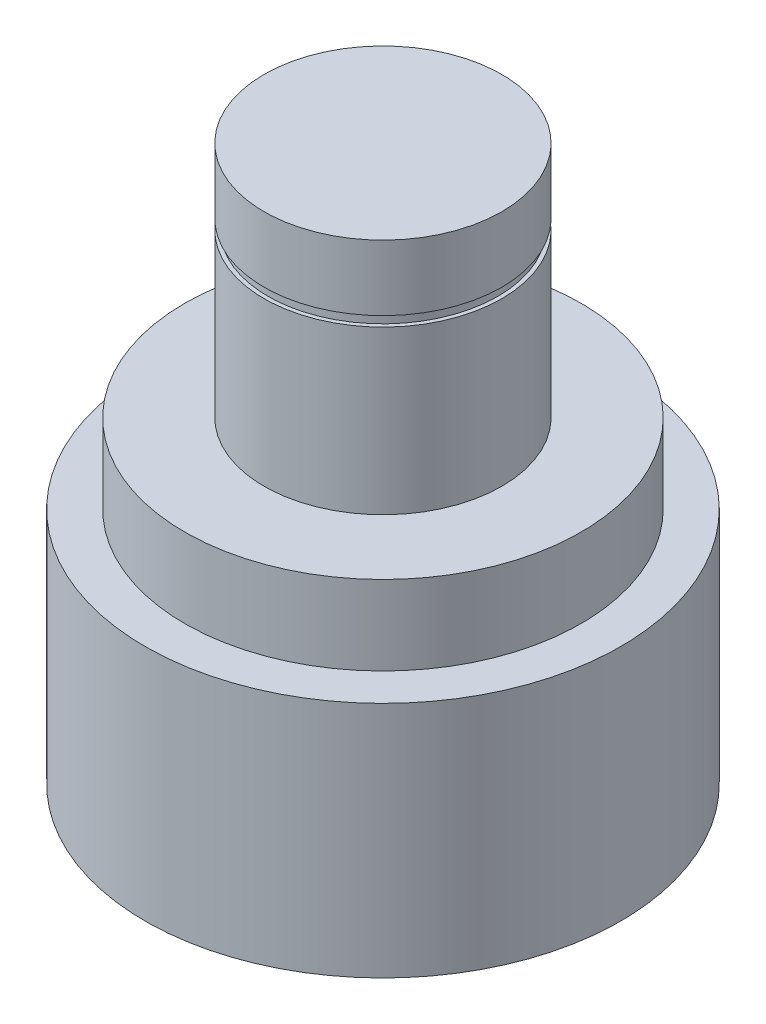
ISO-10303-21;
HEADER;
FILE_DESCRIPTION(('STEP AP214'),'2;1');
FILE_NAME('part.step','',(''),(''),'','','');
FILE_SCHEMA(('AUTOMOTIVE_DESIGN { 1 0 10303 214 1 1 1 1 }'));
ENDSEC;
DATA;
#1=APPLICATION_CONTEXT('core data for automotive mechanical design processes');
#2=APPLICATION_PROTOCOL_DEFINITION('international standard','automotive_design',2000,#1);
#3=PRODUCT_CONTEXT('',#1,'mechanical');
#4=PRODUCT('Part','Part','',(#3));
#5=PRODUCT_RELATED_PRODUCT_CATEGORY('part','',(#4));
#6=PRODUCT_DEFINITION_FORMATION('','',#4);
#7=PRODUCT_DEFINITION_CONTEXT('part definition',#1,'design');
#8=PRODUCT_DEFINITION('design','',#6,#7);
#9=PRODUCT_DEFINITION_SHAPE('','',#8);
#10=(LENGTH_UNIT() NAMED_UNIT(*) SI_UNIT(.MILLI.,.METRE.));
#11=(NAMED_UNIT(*) PLANE_ANGLE_UNIT() SI_UNIT($,.RADIAN.));
#12=(NAMED_UNIT(*) SI_UNIT($,.STERADIAN.) SOLID_ANGLE_UNIT());
#13=UNCERTAINTY_MEASURE_WITH_UNIT(LENGTH_MEASURE(1.E-05),#10,'distance_accuracy_value','');
#14=(GEOMETRIC_REPRESENTATION_CONTEXT(3) GLOBAL_UNCERTAINTY_ASSIGNED_CONTEXT((#13)) GLOBAL_UNIT_ASSIGNED_CONTEXT((#10,
#11,#12)) REPRESENTATION_CONTEXT('',''));
#15=CARTESIAN_POINT('',(0.,0.,0.));
#16=DIRECTION('',(0.,0.,1.));
#17=DIRECTION('',(1.,0.,0.));
#18=AXIS2_PLACEMENT_3D('',#15,#16,#17);
#19=CARTESIAN_POINT('',(0.,14.,0.));
#20=DIRECTION('',(0.,1.,0.));
#21=DIRECTION('',(-1.,0.,0.));
#22=AXIS2_PLACEMENT_3D('',#19,#20,#21);
#23=CYLINDRICAL_SURFACE('',#22,6.);
#24=CARTESIAN_POINT('',(0.,0.,0.));
#25=DIRECTION('',(0.,1.,0.));
#26=DIRECTION('',(-1.,0.,0.));
#27=AXIS2_PLACEMENT_3D('',#24,#25,#26);
#28=CIRCLE('',#27,6.);
#29=CARTESIAN_POINT('',(-6.,0.,0.));
#30=VERTEX_POINT('',#29);
#31=EDGE_CURVE('E62',#30,#30,#28,.T.);
#32=ORIENTED_EDGE('',*,*,#31,.T.);
#33=EDGE_LOOP('',(#32));
#34=FACE_BOUND('',#33,.T.);
#35=CARTESIAN_POINT('',(0.,5.99999999999999,0.));
#36=DIRECTION('',(0.,1.,0.));
#37=DIRECTION('',(-1.,0.,0.));
#38=AXIS2_PLACEMENT_3D('',#35,#36,#37);
#39=CIRCLE('',#38,6.);
#40=CARTESIAN_POINT('',(-6.,5.99999999999999,0.));
#41=VERTEX_POINT('',#40);
#42=EDGE_CURVE('E10',#41,#41,#39,.T.);
#43=ORIENTED_EDGE('',*,*,#42,.F.);
#44=EDGE_LOOP('',(#43));
#45=FACE_BOUND('',#44,.T.);
#46=ADVANCED_FACE('F28',(#34,#45),#23,.T.);
#47=CARTESIAN_POINT('',(-6.00000000000026,5.99999999999974,0.));
#48=DIRECTION('',(0.,1.,0.));
#49=DIRECTION('',(-1.,0.,0.));
#50=AXIS2_PLACEMENT_3D('',#47,#48,#49);
#51=PLANE('',#50);
#52=ORIENTED_EDGE('',*,*,#42,.T.);
#53=EDGE_LOOP('',(#52));
#54=FACE_BOUND('',#53,.T.);
#55=CARTESIAN_POINT('',(0.,5.99999999999999,0.));
#56=DIRECTION('',(0.,1.,0.));
#57=DIRECTION('',(-1.,0.,0.));
#58=AXIS2_PLACEMENT_3D('',#55,#56,#57);
#59=CIRCLE('',#58,5.);
#60=CARTESIAN_POINT('',(-5.,5.99999999999999,0.));
#61=VERTEX_POINT('',#60);
#62=EDGE_CURVE('E34',#61,#61,#59,.T.);
#63=ORIENTED_EDGE('',*,*,#62,.F.);
#64=EDGE_LOOP('',(#63));
#65=FACE_BOUND('',#64,.T.);
#66=ADVANCED_FACE('F79',(#54,#65),#51,.T.);
#67=CARTESIAN_POINT('',(0.,14.,0.));
#68=DIRECTION('',(0.,1.,0.));
#69=DIRECTION('',(-1.,0.,0.));
#70=AXIS2_PLACEMENT_3D('',#67,#68,#69);
#71=CYLINDRICAL_SURFACE('',#70,5.);
#72=ORIENTED_EDGE('',*,*,#62,.T.);
#73=EDGE_LOOP('',(#72));
#74=FACE_BOUND('',#73,.T.);
#75=CARTESIAN_POINT('',(0.,7.99999999999999,0.));
#76=DIRECTION('',(0.,1.,0.));
#77=DIRECTION('',(-1.,0.,0.));
#78=AXIS2_PLACEMENT_3D('',#75,#76,#77);
#79=CIRCLE('',#78,5.);
#80=CARTESIAN_POINT('',(-5.,7.99999999999999,0.));
#81=VERTEX_POINT('',#80);
#82=EDGE_CURVE('E38',#81,#81,#79,.T.);
#83=ORIENTED_EDGE('',*,*,#82,.F.);
#84=EDGE_LOOP('',(#83));
#85=FACE_BOUND('',#84,.T.);
#86=ADVANCED_FACE('F83',(#74,#85),#71,.T.);
#87=CARTESIAN_POINT('',(-5.00000000000026,7.99999999999973,0.));
#88=DIRECTION('',(0.,1.,0.));
#89=DIRECTION('',(-1.,0.,0.));
#90=AXIS2_PLACEMENT_3D('',#87,#88,#89);
#91=PLANE('',#90);
#92=ORIENTED_EDGE('',*,*,#82,.T.);
#93=EDGE_LOOP('',(#92));
#94=FACE_BOUND('',#93,.T.);
#95=CARTESIAN_POINT('',(0.,7.99999999999999,0.));
#96=DIRECTION('',(0.,1.,0.));
#97=DIRECTION('',(-1.,0.,0.));
#98=AXIS2_PLACEMENT_3D('',#95,#96,#97);
#99=CIRCLE('',#98,3.);
#100=CARTESIAN_POINT('',(-3.,7.99999999999999,0.));
#101=VERTEX_POINT('',#100);
#102=EDGE_CURVE('E42',#101,#101,#99,.T.);
#103=ORIENTED_EDGE('',*,*,#102,.F.);
#104=EDGE_LOOP('',(#103));
#105=FACE_BOUND('',#104,.T.);
#106=ADVANCED_FACE('F87',(#94,#105),#91,.T.);
#107=CARTESIAN_POINT('',(0.,14.,0.));
#108=DIRECTION('',(0.,1.,0.));
#109=DIRECTION('',(-1.,0.,0.));
#110=AXIS2_PLACEMENT_3D('',#107,#108,#109);
#111=CYLINDRICAL_SURFACE('',#110,3.);
#112=ORIENTED_EDGE('',*,*,#102,.T.);
#113=EDGE_LOOP('',(#112));
#114=FACE_BOUND('',#113,.T.);
#115=CARTESIAN_POINT('',(0.,12.1,0.));
#116=DIRECTION('',(0.,1.,0.));
#117=DIRECTION('',(-1.,0.,0.));
#118=AXIS2_PLACEMENT_3D('',#115,#116,#117);
#119=CIRCLE('',#118,3.);
#120=CARTESIAN_POINT('',(-3.,12.1,0.));
#121=VERTEX_POINT('',#120);
#122=EDGE_CURVE('E47',#121,#121,#119,.T.);
#123=ORIENTED_EDGE('',*,*,#122,.F.);
#124=EDGE_LOOP('',(#123));
#125=FACE_BOUND('',#124,.T.);
#126=ADVANCED_FACE('F93',(#114,#125),#111,.T.);
#127=CARTESIAN_POINT('',(-3.,12.1,0.));
#128=DIRECTION('',(0.,1.,0.));
#129=DIRECTION('',(-1.,0.,0.));
#130=AXIS2_PLACEMENT_3D('',#127,#128,#129);
#131=PLANE('',#130);
#132=ORIENTED_EDGE('',*,*,#122,.T.);
#133=EDGE_LOOP('',(#132));
#134=FACE_BOUND('',#133,.T.);
#135=CARTESIAN_POINT('',(0.,12.1,0.));
#136=DIRECTION('',(0.,1.,0.));
#137=DIRECTION('',(-1.,0.,0.));
#138=AXIS2_PLACEMENT_3D('',#135,#136,#137);
#139=CIRCLE('',#138,2.9);
#140=CARTESIAN_POINT('',(-2.9,12.1,0.));
#141=VERTEX_POINT('',#140);
#142=EDGE_CURVE('E50',#141,#141,#139,.T.);
#143=ORIENTED_EDGE('',*,*,#142,.F.);
#144=EDGE_LOOP('',(#143));
#145=FACE_BOUND('',#144,.T.);
#146=ADVANCED_FACE('F97',(#134,#145),#131,.T.);
#147=CARTESIAN_POINT('',(0.,14.,0.));
#148=DIRECTION('',(0.,1.,0.));
#149=DIRECTION('',(-1.,0.,0.));
#150=AXIS2_PLACEMENT_3D('',#147,#148,#149);
#151=CYLINDRICAL_SURFACE('',#150,2.9);
#152=ORIENTED_EDGE('',*,*,#142,.T.);
#153=EDGE_LOOP('',(#152));
#154=FACE_BOUND('',#153,.T.);
#155=CARTESIAN_POINT('',(0.,12.35,0.));
#156=DIRECTION('',(0.,1.,0.));
#157=DIRECTION('',(-1.,0.,0.));
#158=AXIS2_PLACEMENT_3D('',#155,#156,#157);
#159=CIRCLE('',#158,2.9);
#160=CARTESIAN_POINT('',(-2.9,12.35,0.));
#161=VERTEX_POINT('',#160);
#162=EDGE_CURVE('E53',#161,#161,#159,.T.);
#163=ORIENTED_EDGE('',*,*,#162,.F.);
#164=EDGE_LOOP('',(#163));
#165=FACE_BOUND('',#164,.T.);
#166=ADVANCED_FACE('F101',(#154,#165),#151,.T.);
#167=CARTESIAN_POINT('',(-3.,12.35,0.));
#168=DIRECTION('',(0.,-1.,0.));
#169=DIRECTION('',(1.,0.,0.));
#170=AXIS2_PLACEMENT_3D('',#167,#168,#169);
#171=PLANE('',#170);
#172=ORIENTED_EDGE('',*,*,#162,.T.);
#173=EDGE_LOOP('',(#172));
#174=FACE_BOUND('',#173,.T.);
#175=CARTESIAN_POINT('',(0.,12.35,0.));
#176=DIRECTION('',(0.,1.,0.));
#177=DIRECTION('',(-1.,0.,0.));
#178=AXIS2_PLACEMENT_3D('',#175,#176,#177);
#179=CIRCLE('',#178,3.);
#180=CARTESIAN_POINT('',(-3.,12.35,0.));
#181=VERTEX_POINT('',#180);
#182=EDGE_CURVE('E56',#181,#181,#179,.T.);
#183=ORIENTED_EDGE('',*,*,#182,.F.);
#184=EDGE_LOOP('',(#183));
#185=FACE_BOUND('',#184,.T.);
#186=ADVANCED_FACE('F105',(#174,#185),#171,.T.);
#187=CARTESIAN_POINT('',(0.,14.,0.));
#188=DIRECTION('',(0.,1.,0.));
#189=DIRECTION('',(-1.,0.,0.));
#190=AXIS2_PLACEMENT_3D('',#187,#188,#189);
#191=CYLINDRICAL_SURFACE('',#190,3.);
#192=ORIENTED_EDGE('',*,*,#182,.T.);
#193=EDGE_LOOP('',(#192));
#194=FACE_BOUND('',#193,.T.);
#195=CARTESIAN_POINT('',(0.,14.,0.));
#196=DIRECTION('',(0.,1.,0.));
#197=DIRECTION('',(-1.,0.,0.));
#198=AXIS2_PLACEMENT_3D('',#195,#196,#197);
#199=CIRCLE('',#198,3.);
#200=CARTESIAN_POINT('',(-3.,14.,0.));
#201=VERTEX_POINT('',#200);
#202=EDGE_CURVE('E59',#201,#201,#199,.T.);
#203=ORIENTED_EDGE('',*,*,#202,.F.);
#204=EDGE_LOOP('',(#203));
#205=FACE_BOUND('',#204,.T.);
#206=ADVANCED_FACE('F75',(#194,#205),#191,.T.);
#207=CARTESIAN_POINT('',(-3.,14.,0.));
#208=DIRECTION('',(0.,1.,0.));
#209=DIRECTION('',(-1.,0.,0.));
#210=AXIS2_PLACEMENT_3D('',#207,#208,#209);
#211=PLANE('',#210);
#212=ORIENTED_EDGE('',*,*,#202,.T.);
#213=EDGE_LOOP('',(#212));
#214=FACE_BOUND('',#213,.T.);
#215=ADVANCED_FACE('F70',(#214),#211,.T.);
#216=CARTESIAN_POINT('',(0.,0.,0.));
#217=DIRECTION('',(0.,-1.,0.));
#218=DIRECTION('',(1.,0.,0.));
#219=AXIS2_PLACEMENT_3D('',#216,#217,#218);
#220=PLANE('',#219);
#221=ORIENTED_EDGE('',*,*,#31,.F.);
#222=EDGE_LOOP('',(#221));
#223=FACE_BOUND('',#222,.T.);
#224=ADVANCED_FACE('F68',(#223),#220,.T.);
#225=CLOSED_SHELL('',(#46,#66,#86,#106,#126,#146,#166,#186,#206,#215,#224));
#226=MANIFOLD_SOLID_BREP('B2',#225);
#227=ADVANCED_BREP_SHAPE_REPRESENTATION('',(#18,#226),#14);
#228=SHAPE_DEFINITION_REPRESENTATION(#9,#227);
ENDSEC;
END-ISO-10303-21;
